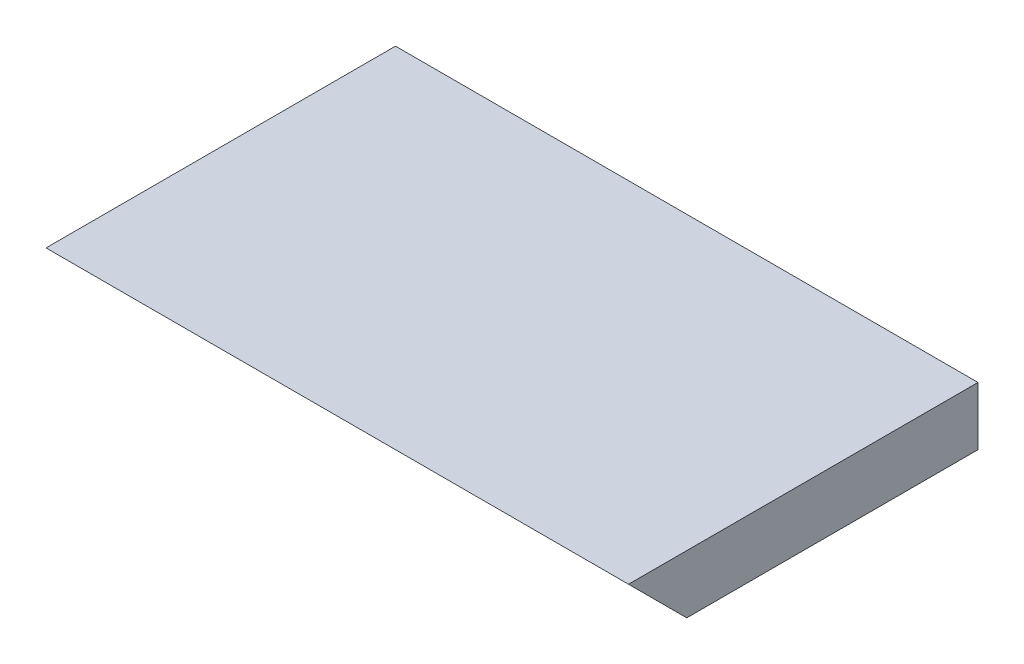
ISO-10303-21;
HEADER;
FILE_DESCRIPTION(('STEP AP214'),'2;1');
FILE_NAME('part.step','',(''),(''),'','','');
FILE_SCHEMA(('AUTOMOTIVE_DESIGN { 1 0 10303 214 1 1 1 1 }'));
ENDSEC;
DATA;
#1=APPLICATION_CONTEXT('core data for automotive mechanical design processes');
#2=APPLICATION_PROTOCOL_DEFINITION('international standard','automotive_design',2000,#1);
#3=PRODUCT_CONTEXT('',#1,'mechanical');
#4=PRODUCT('Part','Part','',(#3));
#5=PRODUCT_RELATED_PRODUCT_CATEGORY('part','',(#4));
#6=PRODUCT_DEFINITION_FORMATION('','',#4);
#7=PRODUCT_DEFINITION_CONTEXT('part definition',#1,'design');
#8=PRODUCT_DEFINITION('design','',#6,#7);
#9=PRODUCT_DEFINITION_SHAPE('','',#8);
#10=(LENGTH_UNIT() NAMED_UNIT(*) SI_UNIT(.MILLI.,.METRE.));
#11=(NAMED_UNIT(*) PLANE_ANGLE_UNIT() SI_UNIT($,.RADIAN.));
#12=(NAMED_UNIT(*) SI_UNIT($,.STERADIAN.) SOLID_ANGLE_UNIT());
#13=UNCERTAINTY_MEASURE_WITH_UNIT(LENGTH_MEASURE(1.E-05),#10,'distance_accuracy_value','');
#14=(GEOMETRIC_REPRESENTATION_CONTEXT(3) GLOBAL_UNCERTAINTY_ASSIGNED_CONTEXT((#13)) GLOBAL_UNIT_ASSIGNED_CONTEXT((#10,
#11,#12)) REPRESENTATION_CONTEXT('',''));
#15=CARTESIAN_POINT('',(0.,0.,0.));
#16=DIRECTION('',(0.,0.,1.));
#17=DIRECTION('',(1.,0.,0.));
#18=AXIS2_PLACEMENT_3D('',#15,#16,#17);
#19=CARTESIAN_POINT('',(25.,5.,15.));
#20=DIRECTION('',(-1.,0.,0.));
#21=DIRECTION('',(0.,0.,1.));
#22=AXIS2_PLACEMENT_3D('',#19,#20,#21);
#23=PLANE('',#22);
#24=DIRECTION('',(0.,0.,-1.));
#25=VECTOR('',#24,1.);
#26=CARTESIAN_POINT('',(25.,5.,15.));
#27=LINE('',#26,#25);
#28=CARTESIAN_POINT('',(25.,5.,15.));
#29=VERTEX_POINT('',#28);
#30=CARTESIAN_POINT('',(25.,5.,-15.));
#31=VERTEX_POINT('',#30);
#32=EDGE_CURVE('E84',#29,#31,#27,.T.);
#33=ORIENTED_EDGE('',*,*,#32,.F.);
#34=DIRECTION('',(0.,-0.707106781186546,-0.707106781186549));
#35=VECTOR('',#34,1.);
#36=CARTESIAN_POINT('',(25.,5.,15.));
#37=LINE('',#36,#35);
#38=CARTESIAN_POINT('',(25.,0.,9.99999999999998));
#39=VERTEX_POINT('',#38);
#40=EDGE_CURVE('E55',#29,#39,#37,.T.);
#41=ORIENTED_EDGE('',*,*,#40,.T.);
#42=DIRECTION('',(0.,0.,-1.));
#43=VECTOR('',#42,1.);
#44=CARTESIAN_POINT('',(25.,0.,15.));
#45=LINE('',#44,#43);
#46=CARTESIAN_POINT('',(25.,0.,-15.));
#47=VERTEX_POINT('',#46);
#48=EDGE_CURVE('E92',#39,#47,#45,.T.);
#49=ORIENTED_EDGE('',*,*,#48,.T.);
#50=DIRECTION('',(0.,-1.,0.));
#51=VECTOR('',#50,1.);
#52=CARTESIAN_POINT('',(25.,5.,-15.));
#53=LINE('',#52,#51);
#54=EDGE_CURVE('E77',#31,#47,#53,.T.);
#55=ORIENTED_EDGE('',*,*,#54,.F.);
#56=EDGE_LOOP('',(#33,#41,#49,#55));
#57=FACE_BOUND('',#56,.T.);
#58=ADVANCED_FACE('F33',(#57),#23,.F.);
#59=CARTESIAN_POINT('',(-25.,5.,-15.));
#60=DIRECTION('',(0.,0.,1.));
#61=DIRECTION('',(1.,0.,0.));
#62=AXIS2_PLACEMENT_3D('',#59,#60,#61);
#63=PLANE('',#62);
#64=DIRECTION('',(-1.,0.,0.));
#65=VECTOR('',#64,1.);
#66=CARTESIAN_POINT('',(-25.,0.,-15.));
#67=LINE('',#66,#65);
#68=CARTESIAN_POINT('',(-25.,0.,-15.));
#69=VERTEX_POINT('',#68);
#70=EDGE_CURVE('E99',#47,#69,#67,.T.);
#71=ORIENTED_EDGE('',*,*,#70,.T.);
#72=DIRECTION('',(0.,-1.,0.));
#73=VECTOR('',#72,1.);
#74=CARTESIAN_POINT('',(-25.,5.,-15.));
#75=LINE('',#74,#73);
#76=CARTESIAN_POINT('',(-25.,5.,-15.));
#77=VERTEX_POINT('',#76);
#78=EDGE_CURVE('E79',#77,#69,#75,.T.);
#79=ORIENTED_EDGE('',*,*,#78,.F.);
#80=DIRECTION('',(-1.,0.,0.));
#81=VECTOR('',#80,1.);
#82=CARTESIAN_POINT('',(-25.,5.,-15.));
#83=LINE('',#82,#81);
#84=EDGE_CURVE('E73',#31,#77,#83,.T.);
#85=ORIENTED_EDGE('',*,*,#84,.F.);
#86=ORIENTED_EDGE('',*,*,#54,.T.);
#87=EDGE_LOOP('',(#71,#79,#85,#86));
#88=FACE_BOUND('',#87,.T.);
#89=ADVANCED_FACE('F75',(#88),#63,.F.);
#90=CARTESIAN_POINT('',(-25.,5.,15.));
#91=DIRECTION('',(1.,0.,0.));
#92=DIRECTION('',(0.,0.,-1.));
#93=AXIS2_PLACEMENT_3D('',#90,#91,#92);
#94=PLANE('',#93);
#95=DIRECTION('',(0.,0.,1.));
#96=VECTOR('',#95,1.);
#97=CARTESIAN_POINT('',(-25.,0.,15.));
#98=LINE('',#97,#96);
#99=CARTESIAN_POINT('',(-25.,0.,9.99999999999998));
#100=VERTEX_POINT('',#99);
#101=EDGE_CURVE('E90',#69,#100,#98,.T.);
#102=ORIENTED_EDGE('',*,*,#101,.T.);
#103=DIRECTION('',(0.,0.707106781186546,0.707106781186549));
#104=VECTOR('',#103,1.);
#105=CARTESIAN_POINT('',(-25.,5.,15.));
#106=LINE('',#105,#104);
#107=CARTESIAN_POINT('',(-25.,5.,15.));
#108=VERTEX_POINT('',#107);
#109=EDGE_CURVE('E11',#100,#108,#106,.T.);
#110=ORIENTED_EDGE('',*,*,#109,.T.);
#111=DIRECTION('',(0.,0.,1.));
#112=VECTOR('',#111,1.);
#113=CARTESIAN_POINT('',(-25.,5.,15.));
#114=LINE('',#113,#112);
#115=EDGE_CURVE('E83',#77,#108,#114,.T.);
#116=ORIENTED_EDGE('',*,*,#115,.F.);
#117=ORIENTED_EDGE('',*,*,#78,.T.);
#118=EDGE_LOOP('',(#102,#110,#116,#117));
#119=FACE_BOUND('',#118,.T.);
#120=ADVANCED_FACE('F106',(#119),#94,.F.);
#121=CARTESIAN_POINT('',(0.,5.,0.));
#122=DIRECTION('',(0.,-1.,0.));
#123=DIRECTION('',(0.,0.,-1.));
#124=AXIS2_PLACEMENT_3D('',#121,#122,#123);
#125=PLANE('',#124);
#126=ORIENTED_EDGE('',*,*,#32,.T.);
#127=ORIENTED_EDGE('',*,*,#84,.T.);
#128=ORIENTED_EDGE('',*,*,#115,.T.);
#129=DIRECTION('',(1.,0.,0.));
#130=VECTOR('',#129,1.);
#131=CARTESIAN_POINT('',(-25.,5.,15.));
#132=LINE('',#131,#130);
#133=EDGE_CURVE('E89',#108,#29,#132,.T.);
#134=ORIENTED_EDGE('',*,*,#133,.T.);
#135=EDGE_LOOP('',(#126,#127,#128,#134));
#136=FACE_BOUND('',#135,.T.);
#137=ADVANCED_FACE('F87',(#136),#125,.F.);
#138=CARTESIAN_POINT('',(0.,0.,0.));
#139=DIRECTION('',(0.,-1.,0.));
#140=DIRECTION('',(0.,0.,-1.));
#141=AXIS2_PLACEMENT_3D('',#138,#139,#140);
#142=PLANE('',#141);
#143=ORIENTED_EDGE('',*,*,#48,.F.);
#144=DIRECTION('',(-1.,0.,0.));
#145=VECTOR('',#144,1.);
#146=CARTESIAN_POINT('',(-25.,0.,9.99999999999998));
#147=LINE('',#146,#145);
#148=EDGE_CURVE('E41',#39,#100,#147,.T.);
#149=ORIENTED_EDGE('',*,*,#148,.T.);
#150=ORIENTED_EDGE('',*,*,#101,.F.);
#151=ORIENTED_EDGE('',*,*,#70,.F.);
#152=EDGE_LOOP('',(#143,#149,#150,#151));
#153=FACE_BOUND('',#152,.T.);
#154=ADVANCED_FACE('F107',(#153),#142,.T.);
#155=CARTESIAN_POINT('',(-25.,5.,15.));
#156=DIRECTION('',(0.,-0.707106781186549,0.707106781186546));
#157=DIRECTION('',(-1.,0.,0.));
#158=AXIS2_PLACEMENT_3D('',#155,#156,#157);
#159=PLANE('',#158);
#160=ORIENTED_EDGE('',*,*,#109,.F.);
#161=ORIENTED_EDGE('',*,*,#148,.F.);
#162=ORIENTED_EDGE('',*,*,#40,.F.);
#163=ORIENTED_EDGE('',*,*,#133,.F.);
#164=EDGE_LOOP('',(#160,#161,#162,#163));
#165=FACE_BOUND('',#164,.T.);
#166=ADVANCED_FACE('F35',(#165),#159,.T.);
#167=CLOSED_SHELL('',(#58,#89,#120,#137,#154,#166));
#168=MANIFOLD_SOLID_BREP('B2',#167);
#169=ADVANCED_BREP_SHAPE_REPRESENTATION('',(#18,#168),#14);
#170=SHAPE_DEFINITION_REPRESENTATION(#9,#169);
ENDSEC;
END-ISO-10303-21;
